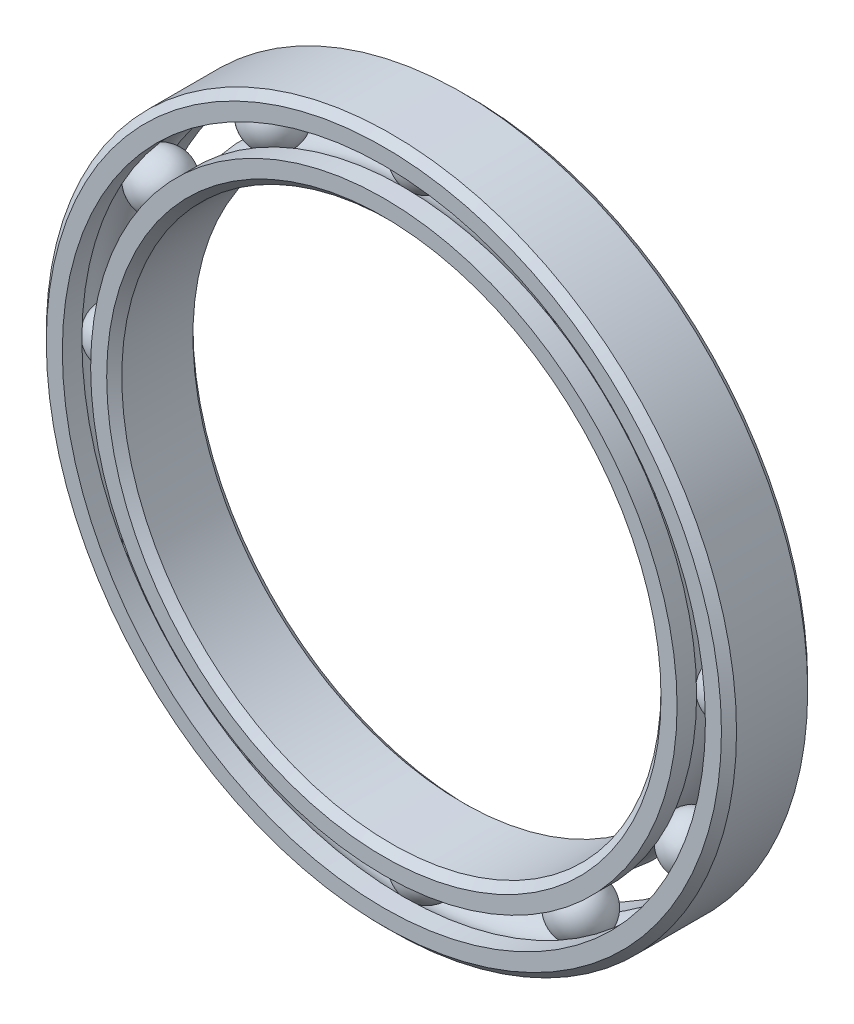
ISO-10303-21;
HEADER;
FILE_DESCRIPTION(('STEP AP214'),'2;1');
FILE_NAME('part.step','',(''),(''),'','','');
FILE_SCHEMA(('AUTOMOTIVE_DESIGN { 1 0 10303 214 1 1 1 1 }'));
ENDSEC;
DATA;
#1=APPLICATION_CONTEXT('core data for automotive mechanical design processes');
#2=APPLICATION_PROTOCOL_DEFINITION('international standard','automotive_design',2000,#1);
#3=PRODUCT_CONTEXT('',#1,'mechanical');
#4=PRODUCT('Part','Part','',(#3));
#5=PRODUCT_RELATED_PRODUCT_CATEGORY('part','',(#4));
#6=PRODUCT_DEFINITION_FORMATION('','',#4);
#7=PRODUCT_DEFINITION_CONTEXT('part definition',#1,'design');
#8=PRODUCT_DEFINITION('design','',#6,#7);
#9=PRODUCT_DEFINITION_SHAPE('','',#8);
#10=(LENGTH_UNIT() NAMED_UNIT(*) SI_UNIT(.MILLI.,.METRE.));
#11=(NAMED_UNIT(*) PLANE_ANGLE_UNIT() SI_UNIT($,.RADIAN.));
#12=(NAMED_UNIT(*) SI_UNIT($,.STERADIAN.) SOLID_ANGLE_UNIT());
#13=UNCERTAINTY_MEASURE_WITH_UNIT(LENGTH_MEASURE(1.E-05),#10,'distance_accuracy_value','');
#14=(GEOMETRIC_REPRESENTATION_CONTEXT(3) GLOBAL_UNCERTAINTY_ASSIGNED_CONTEXT((#13)) GLOBAL_UNIT_ASSIGNED_CONTEXT((#10,
#11,#12)) REPRESENTATION_CONTEXT('',''));
#15=CARTESIAN_POINT('',(0.,0.,0.));
#16=DIRECTION('',(0.,0.,1.));
#17=DIRECTION('',(1.,0.,0.));
#18=AXIS2_PLACEMENT_3D('',#15,#16,#17);
#19=CARTESIAN_POINT('',(-7.12499999999984,12.3408620039283,0.));
#20=DIRECTION('',(0.,0.,1.));
#21=DIRECTION('',(-0.499999999999989,0.866025403784445,0.));
#22=AXIS2_PLACEMENT_3D('',#19,#20,#21);
#23=SPHERICAL_SURFACE('',#22,1.27579703293945);
#24=CARTESIAN_POINT('',(-7.12499999999984,12.3408620039283,1.27579703293945));
#25=VERTEX_POINT('',#24);
#26=VERTEX_LOOP('',#25);
#27=FACE_BOUND('',#26,.T.);
#28=ADVANCED_FACE('F38',(#27),#23,.T.);
#29=CLOSED_SHELL('',(#28));
#30=MANIFOLD_SOLID_BREP('B2',#29);
#31=CARTESIAN_POINT('',(-12.3408620039282,7.12500000000014,0.));
#32=DIRECTION('',(0.,0.,1.));
#33=DIRECTION('',(-0.866025403784433,0.50000000000001,0.));
#34=AXIS2_PLACEMENT_3D('',#31,#32,#33);
#35=SPHERICAL_SURFACE('',#34,1.27579703293945);
#36=CARTESIAN_POINT('',(-12.3408620039282,7.12500000000014,1.27579703293945));
#37=VERTEX_POINT('',#36);
#38=VERTEX_LOOP('',#37);
#39=FACE_BOUND('',#38,.T.);
#40=ADVANCED_FACE('F59',(#39),#35,.T.);
#41=CLOSED_SHELL('',(#40));
#42=MANIFOLD_SOLID_BREP('B6',#41);
#43=CARTESIAN_POINT('',(-14.25,1.49260827235544E-13,0.));
#44=DIRECTION('',(0.,0.,1.));
#45=DIRECTION('',(-1.,0.,0.));
#46=AXIS2_PLACEMENT_3D('',#43,#44,#45);
#47=SPHERICAL_SURFACE('',#46,1.27579703293945);
#48=CARTESIAN_POINT('',(-14.25,1.49260827235544E-13,1.27579703293945));
#49=VERTEX_POINT('',#48);
#50=VERTEX_LOOP('',#49);
#51=FACE_BOUND('',#50,.T.);
#52=ADVANCED_FACE('F80',(#51),#47,.T.);
#53=CLOSED_SHELL('',(#52));
#54=MANIFOLD_SOLID_BREP('B34',#53);
#55=CARTESIAN_POINT('',(-12.3408620039283,-7.12499999999989,0.));
#56=DIRECTION('',(0.,0.,1.));
#57=DIRECTION('',(-0.866025403784443,-0.499999999999992,0.));
#58=AXIS2_PLACEMENT_3D('',#55,#56,#57);
#59=SPHERICAL_SURFACE('',#58,1.27579703293945);
#60=CARTESIAN_POINT('',(-12.3408620039283,-7.12499999999989,1.27579703293945));
#61=VERTEX_POINT('',#60);
#62=VERTEX_LOOP('',#61);
#63=FACE_BOUND('',#62,.T.);
#64=ADVANCED_FACE('F101',(#63),#59,.T.);
#65=CLOSED_SHELL('',(#64));
#66=MANIFOLD_SOLID_BREP('B55',#65);
#67=CARTESIAN_POINT('',(-7.1250000000001,-12.3408620039282,0.));
#68=DIRECTION('',(0.,0.,1.));
#69=DIRECTION('',(-0.500000000000007,-0.866025403784435,0.));
#70=AXIS2_PLACEMENT_3D('',#67,#68,#69);
#71=SPHERICAL_SURFACE('',#70,1.27579703293945);
#72=CARTESIAN_POINT('',(-7.1250000000001,-12.3408620039282,1.27579703293945));
#73=VERTEX_POINT('',#72);
#74=VERTEX_LOOP('',#73);
#75=FACE_BOUND('',#74,.T.);
#76=ADVANCED_FACE('F122',(#75),#71,.T.);
#77=CLOSED_SHELL('',(#76));
#78=MANIFOLD_SOLID_BREP('B76',#77);
#79=CARTESIAN_POINT('',(0.,-14.25,0.));
#80=DIRECTION('',(0.,0.,1.));
#81=DIRECTION('',(0.,-1.,0.));
#82=AXIS2_PLACEMENT_3D('',#79,#80,#81);
#83=SPHERICAL_SURFACE('',#82,1.27579703293945);
#84=CARTESIAN_POINT('',(0.,-14.25,1.27579703293945));
#85=VERTEX_POINT('',#84);
#86=VERTEX_LOOP('',#85);
#87=FACE_BOUND('',#86,.T.);
#88=ADVANCED_FACE('F143',(#87),#83,.T.);
#89=CLOSED_SHELL('',(#88));
#90=MANIFOLD_SOLID_BREP('B97',#89);
#91=CARTESIAN_POINT('',(7.12499999999993,-12.3408620039283,0.));
#92=DIRECTION('',(0.,0.,1.));
#93=DIRECTION('',(0.499999999999995,-0.866025403784442,0.));
#94=AXIS2_PLACEMENT_3D('',#91,#92,#93);
#95=SPHERICAL_SURFACE('',#94,1.27579703293945);
#96=CARTESIAN_POINT('',(7.12499999999993,-12.3408620039283,1.27579703293945));
#97=VERTEX_POINT('',#96);
#98=VERTEX_LOOP('',#97);
#99=FACE_BOUND('',#98,.T.);
#100=ADVANCED_FACE('F164',(#99),#95,.T.);
#101=CLOSED_SHELL('',(#100));
#102=MANIFOLD_SOLID_BREP('B118',#101);
#103=CARTESIAN_POINT('',(12.3408620039282,-7.12500000000006,0.));
#104=DIRECTION('',(0.,0.,1.));
#105=DIRECTION('',(0.866025403784436,-0.500000000000004,0.));
#106=AXIS2_PLACEMENT_3D('',#103,#104,#105);
#107=SPHERICAL_SURFACE('',#106,1.27579703293945);
#108=CARTESIAN_POINT('',(12.3408620039282,-7.12500000000006,1.27579703293945));
#109=VERTEX_POINT('',#108);
#110=VERTEX_LOOP('',#109);
#111=FACE_BOUND('',#110,.T.);
#112=ADVANCED_FACE('F185',(#111),#107,.T.);
#113=CLOSED_SHELL('',(#112));
#114=MANIFOLD_SOLID_BREP('B139',#113);
#115=CARTESIAN_POINT('',(14.25,0.,0.));
#116=DIRECTION('',(0.,0.,1.));
#117=DIRECTION('',(1.,0.,0.));
#118=AXIS2_PLACEMENT_3D('',#115,#116,#117);
#119=SPHERICAL_SURFACE('',#118,1.27579703293945);
#120=CARTESIAN_POINT('',(14.25,0.,1.27579703293945));
#121=VERTEX_POINT('',#120);
#122=VERTEX_LOOP('',#121);
#123=FACE_BOUND('',#122,.T.);
#124=ADVANCED_FACE('F206',(#123),#119,.T.);
#125=CLOSED_SHELL('',(#124));
#126=MANIFOLD_SOLID_BREP('B160',#125);
#127=CARTESIAN_POINT('',(12.3408620039283,7.12499999999997,0.));
#128=DIRECTION('',(0.,0.,1.));
#129=DIRECTION('',(0.86602540378444,0.499999999999998,0.));
#130=AXIS2_PLACEMENT_3D('',#127,#128,#129);
#131=SPHERICAL_SURFACE('',#130,1.27579703293945);
#132=CARTESIAN_POINT('',(12.3408620039283,7.12499999999997,1.27579703293945));
#133=VERTEX_POINT('',#132);
#134=VERTEX_LOOP('',#133);
#135=FACE_BOUND('',#134,.T.);
#136=ADVANCED_FACE('F227',(#135),#131,.T.);
#137=CLOSED_SHELL('',(#136));
#138=MANIFOLD_SOLID_BREP('B181',#137);
#139=CARTESIAN_POINT('',(7.12500000000001,12.3408620039282,0.));
#140=DIRECTION('',(0.,0.,1.));
#141=DIRECTION('',(0.500000000000001,0.866025403784438,0.));
#142=AXIS2_PLACEMENT_3D('',#139,#140,#141);
#143=SPHERICAL_SURFACE('',#142,1.27579703293945);
#144=CARTESIAN_POINT('',(7.12500000000001,12.3408620039282,1.27579703293945));
#145=VERTEX_POINT('',#144);
#146=VERTEX_LOOP('',#145);
#147=FACE_BOUND('',#146,.T.);
#148=ADVANCED_FACE('F248',(#147),#143,.T.);
#149=CLOSED_SHELL('',(#148));
#150=MANIFOLD_SOLID_BREP('B202',#149);
#151=CARTESIAN_POINT('',(0.,14.25,0.));
#152=DIRECTION('',(0.,0.,1.));
#153=DIRECTION('',(0.,1.,0.));
#154=AXIS2_PLACEMENT_3D('',#151,#152,#153);
#155=SPHERICAL_SURFACE('',#154,1.27579703293945);
#156=CARTESIAN_POINT('',(0.,14.25,1.27579703293945));
#157=VERTEX_POINT('',#156);
#158=VERTEX_LOOP('',#157);
#159=FACE_BOUND('',#158,.T.);
#160=ADVANCED_FACE('F271',(#159),#155,.T.);
#161=CLOSED_SHELL('',(#160));
#162=MANIFOLD_SOLID_BREP('B223',#161);
#163=CARTESIAN_POINT('',(0.,13.5936973450183,2.));
#164=DIRECTION('',(0.,0.,-1.));
#165=DIRECTION('',(-1.,0.,0.));
#166=AXIS2_PLACEMENT_3D('',#163,#164,#165);
#167=PLANE('',#166);
#168=CARTESIAN_POINT('',(0.,0.,2.));
#169=DIRECTION('',(0.,0.,1.));
#170=DIRECTION('',(1.,0.,0.));
#171=AXIS2_PLACEMENT_3D('',#168,#169,#170);
#172=CIRCLE('',#171,12.85);
#173=CARTESIAN_POINT('',(12.85,0.,2.));
#174=VERTEX_POINT('',#173);
#175=EDGE_CURVE('E319',#174,#174,#172,.T.);
#176=ORIENTED_EDGE('',*,*,#175,.F.);
#177=EDGE_LOOP('',(#176));
#178=FACE_BOUND('',#177,.T.);
#179=CARTESIAN_POINT('',(0.,0.,2.));
#180=DIRECTION('',(0.,0.,1.));
#181=DIRECTION('',(1.,0.,0.));
#182=AXIS2_PLACEMENT_3D('',#179,#180,#181);
#183=CIRCLE('',#182,13.5936973450183);
#184=CARTESIAN_POINT('',(13.5936973450183,0.,2.));
#185=VERTEX_POINT('',#184);
#186=EDGE_CURVE('E270',#185,#185,#183,.T.);
#187=ORIENTED_EDGE('',*,*,#186,.T.);
#188=EDGE_LOOP('',(#187));
#189=FACE_BOUND('',#188,.T.);
#190=ADVANCED_FACE('F291',(#178,#189),#167,.F.);
#191=CARTESIAN_POINT('',(0.,0.,2.));
#192=DIRECTION('',(0.,0.,1.));
#193=DIRECTION('',(1.,0.,0.));
#194=AXIS2_PLACEMENT_3D('',#191,#192,#193);
#195=CYLINDRICAL_SURFACE('',#194,13.5936973450183);
#196=ORIENTED_EDGE('',*,*,#186,.F.);
#197=EDGE_LOOP('',(#196));
#198=FACE_BOUND('',#197,.T.);
#199=CARTESIAN_POINT('',(0.,0.,1.0940406273631));
#200=DIRECTION('',(0.,0.,1.));
#201=DIRECTION('',(1.,0.,0.));
#202=AXIS2_PLACEMENT_3D('',#199,#200,#201);
#203=CIRCLE('',#202,13.5936973450183);
#204=CARTESIAN_POINT('',(13.5936973450183,0.,1.0940406273631));
#205=VERTEX_POINT('',#204);
#206=EDGE_CURVE('E297',#205,#205,#203,.T.);
#207=ORIENTED_EDGE('',*,*,#206,.T.);
#208=EDGE_LOOP('',(#207));
#209=FACE_BOUND('',#208,.T.);
#210=ADVANCED_FACE('F326',(#198,#209),#195,.T.);
#211=CARTESIAN_POINT('',(0.,0.,0.));
#212=DIRECTION('',(0.,0.,1.));
#213=DIRECTION('',(1.,0.,0.));
#214=AXIS2_PLACEMENT_3D('',#211,#212,#213);
#215=TOROIDAL_SURFACE('',#214,14.25,1.27579703293944);
#216=ORIENTED_EDGE('',*,*,#206,.F.);
#217=EDGE_LOOP('',(#216));
#218=FACE_BOUND('',#217,.T.);
#219=CARTESIAN_POINT('',(0.,0.,-1.0940406273631));
#220=DIRECTION('',(0.,0.,1.));
#221=DIRECTION('',(1.,0.,0.));
#222=AXIS2_PLACEMENT_3D('',#219,#220,#221);
#223=CIRCLE('',#222,13.5936973450183);
#224=CARTESIAN_POINT('',(13.5936973450183,0.,-1.0940406273631));
#225=VERTEX_POINT('',#224);
#226=EDGE_CURVE('E301',#225,#225,#223,.T.);
#227=ORIENTED_EDGE('',*,*,#226,.T.);
#228=EDGE_LOOP('',(#227));
#229=FACE_BOUND('',#228,.T.);
#230=ADVANCED_FACE('F330',(#218,#229),#215,.F.);
#231=CARTESIAN_POINT('',(0.,0.,2.));
#232=DIRECTION('',(0.,0.,1.));
#233=DIRECTION('',(1.,0.,0.));
#234=AXIS2_PLACEMENT_3D('',#231,#232,#233);
#235=CYLINDRICAL_SURFACE('',#234,13.5936973450183);
#236=ORIENTED_EDGE('',*,*,#226,.F.);
#237=EDGE_LOOP('',(#236));
#238=FACE_BOUND('',#237,.T.);
#239=CARTESIAN_POINT('',(0.,0.,-2.));
#240=DIRECTION('',(0.,0.,1.));
#241=DIRECTION('',(1.,0.,0.));
#242=AXIS2_PLACEMENT_3D('',#239,#240,#241);
#243=CIRCLE('',#242,13.5936973450183);
#244=CARTESIAN_POINT('',(13.5936973450183,0.,-2.));
#245=VERTEX_POINT('',#244);
#246=EDGE_CURVE('E305',#245,#245,#243,.T.);
#247=ORIENTED_EDGE('',*,*,#246,.T.);
#248=EDGE_LOOP('',(#247));
#249=FACE_BOUND('',#248,.T.);
#250=ADVANCED_FACE('F335',(#238,#249),#235,.T.);
#251=CARTESIAN_POINT('',(0.,12.85,-2.));
#252=DIRECTION('',(0.,0.,1.));
#253=DIRECTION('',(1.,0.,0.));
#254=AXIS2_PLACEMENT_3D('',#251,#252,#253);
#255=PLANE('',#254);
#256=ORIENTED_EDGE('',*,*,#246,.F.);
#257=EDGE_LOOP('',(#256));
#258=FACE_BOUND('',#257,.T.);
#259=CARTESIAN_POINT('',(0.,0.,-2.));
#260=DIRECTION('',(0.,0.,1.));
#261=DIRECTION('',(1.,0.,0.));
#262=AXIS2_PLACEMENT_3D('',#259,#260,#261);
#263=CIRCLE('',#262,12.85);
#264=CARTESIAN_POINT('',(12.85,0.,-2.));
#265=VERTEX_POINT('',#264);
#266=EDGE_CURVE('E310',#265,#265,#263,.T.);
#267=ORIENTED_EDGE('',*,*,#266,.T.);
#268=EDGE_LOOP('',(#267));
#269=FACE_BOUND('',#268,.T.);
#270=ADVANCED_FACE('F341',(#258,#269),#255,.F.);
#271=CARTESIAN_POINT('',(0.,0.,-1.65));
#272=DIRECTION('',(0.,0.,-1.));
#273=DIRECTION('',(-1.,0.,0.));
#274=AXIS2_PLACEMENT_3D('',#271,#272,#273);
#275=CONICAL_SURFACE('',#274,12.5,0.785398163397443);
#276=ORIENTED_EDGE('',*,*,#266,.F.);
#277=EDGE_LOOP('',(#276));
#278=FACE_BOUND('',#277,.T.);
#279=CARTESIAN_POINT('',(0.,0.,-1.65));
#280=DIRECTION('',(0.,0.,1.));
#281=DIRECTION('',(1.,0.,0.));
#282=AXIS2_PLACEMENT_3D('',#279,#280,#281);
#283=CIRCLE('',#282,12.5);
#284=CARTESIAN_POINT('',(12.5,0.,-1.65));
#285=VERTEX_POINT('',#284);
#286=EDGE_CURVE('E313',#285,#285,#283,.T.);
#287=ORIENTED_EDGE('',*,*,#286,.T.);
#288=EDGE_LOOP('',(#287));
#289=FACE_BOUND('',#288,.T.);
#290=ADVANCED_FACE('F345',(#278,#289),#275,.F.);
#291=CARTESIAN_POINT('',(0.,0.,2.));
#292=DIRECTION('',(0.,0.,1.));
#293=DIRECTION('',(1.,0.,0.));
#294=AXIS2_PLACEMENT_3D('',#291,#292,#293);
#295=CYLINDRICAL_SURFACE('',#294,12.5);
#296=ORIENTED_EDGE('',*,*,#286,.F.);
#297=EDGE_LOOP('',(#296));
#298=FACE_BOUND('',#297,.T.);
#299=CARTESIAN_POINT('',(0.,0.,1.65000000000001));
#300=DIRECTION('',(0.,0.,1.));
#301=DIRECTION('',(1.,0.,0.));
#302=AXIS2_PLACEMENT_3D('',#299,#300,#301);
#303=CIRCLE('',#302,12.5);
#304=CARTESIAN_POINT('',(12.5,0.,1.65000000000001));
#305=VERTEX_POINT('',#304);
#306=EDGE_CURVE('E316',#305,#305,#303,.T.);
#307=ORIENTED_EDGE('',*,*,#306,.T.);
#308=EDGE_LOOP('',(#307));
#309=FACE_BOUND('',#308,.T.);
#310=ADVANCED_FACE('F349',(#298,#309),#295,.F.);
#311=CARTESIAN_POINT('',(0.,0.,2.));
#312=DIRECTION('',(0.,0.,1.));
#313=DIRECTION('',(1.,0.,0.));
#314=AXIS2_PLACEMENT_3D('',#311,#312,#313);
#315=CONICAL_SURFACE('',#314,12.85,0.785398163397454);
#316=ORIENTED_EDGE('',*,*,#306,.F.);
#317=EDGE_LOOP('',(#316));
#318=FACE_BOUND('',#317,.T.);
#319=ORIENTED_EDGE('',*,*,#175,.T.);
#320=EDGE_LOOP('',(#319));
#321=FACE_BOUND('',#320,.T.);
#322=ADVANCED_FACE('F323',(#318,#321),#315,.F.);
#323=CLOSED_SHELL('',(#190,#210,#230,#250,#270,#290,#310,#322));
#324=MANIFOLD_SOLID_BREP('B244',#323);
#325=CARTESIAN_POINT('',(0.,0.,1.65));
#326=DIRECTION('',(0.,0.,-1.));
#327=DIRECTION('',(-1.,0.,0.));
#328=AXIS2_PLACEMENT_3D('',#325,#326,#327);
#329=CONICAL_SURFACE('',#328,16.,0.785398163397443);
#330=CARTESIAN_POINT('',(0.,0.,2.));
#331=DIRECTION('',(0.,0.,1.));
#332=DIRECTION('',(1.,0.,0.));
#333=AXIS2_PLACEMENT_3D('',#330,#331,#332);
#334=CIRCLE('',#333,15.65);
#335=CARTESIAN_POINT('',(15.65,0.,2.));
#336=VERTEX_POINT('',#335);
#337=EDGE_CURVE('E441',#336,#336,#334,.T.);
#338=ORIENTED_EDGE('',*,*,#337,.F.);
#339=EDGE_LOOP('',(#338));
#340=FACE_BOUND('',#339,.T.);
#341=CARTESIAN_POINT('',(0.,0.,1.65));
#342=DIRECTION('',(0.,0.,1.));
#343=DIRECTION('',(1.,0.,0.));
#344=AXIS2_PLACEMENT_3D('',#341,#342,#343);
#345=CIRCLE('',#344,16.);
#346=CARTESIAN_POINT('',(16.,0.,1.65));
#347=VERTEX_POINT('',#346);
#348=EDGE_CURVE('E290',#347,#347,#345,.T.);
#349=ORIENTED_EDGE('',*,*,#348,.T.);
#350=EDGE_LOOP('',(#349));
#351=FACE_BOUND('',#350,.T.);
#352=ADVANCED_FACE('F413',(#340,#351),#329,.T.);
#353=CARTESIAN_POINT('',(0.,0.,2.));
#354=DIRECTION('',(0.,0.,1.));
#355=DIRECTION('',(1.,0.,0.));
#356=AXIS2_PLACEMENT_3D('',#353,#354,#355);
#357=CYLINDRICAL_SURFACE('',#356,16.);
#358=ORIENTED_EDGE('',*,*,#348,.F.);
#359=EDGE_LOOP('',(#358));
#360=FACE_BOUND('',#359,.T.);
#361=CARTESIAN_POINT('',(0.,0.,-1.65));
#362=DIRECTION('',(0.,0.,1.));
#363=DIRECTION('',(1.,0.,0.));
#364=AXIS2_PLACEMENT_3D('',#361,#362,#363);
#365=CIRCLE('',#364,16.);
#366=CARTESIAN_POINT('',(16.,0.,-1.65));
#367=VERTEX_POINT('',#366);
#368=EDGE_CURVE('E419',#367,#367,#365,.T.);
#369=ORIENTED_EDGE('',*,*,#368,.T.);
#370=EDGE_LOOP('',(#369));
#371=FACE_BOUND('',#370,.T.);
#372=ADVANCED_FACE('F448',(#360,#371),#357,.T.);
#373=CARTESIAN_POINT('',(0.,0.,-2.));
#374=DIRECTION('',(0.,0.,1.));
#375=DIRECTION('',(1.,0.,0.));
#376=AXIS2_PLACEMENT_3D('',#373,#374,#375);
#377=CONICAL_SURFACE('',#376,15.65,0.785398163397443);
#378=ORIENTED_EDGE('',*,*,#368,.F.);
#379=EDGE_LOOP('',(#378));
#380=FACE_BOUND('',#379,.T.);
#381=CARTESIAN_POINT('',(0.,0.,-2.));
#382=DIRECTION('',(0.,0.,1.));
#383=DIRECTION('',(1.,0.,0.));
#384=AXIS2_PLACEMENT_3D('',#381,#382,#383);
#385=CIRCLE('',#384,15.65);
#386=CARTESIAN_POINT('',(15.65,0.,-2.));
#387=VERTEX_POINT('',#386);
#388=EDGE_CURVE('E423',#387,#387,#385,.T.);
#389=ORIENTED_EDGE('',*,*,#388,.T.);
#390=EDGE_LOOP('',(#389));
#391=FACE_BOUND('',#390,.T.);
#392=ADVANCED_FACE('F452',(#380,#391),#377,.T.);
#393=CARTESIAN_POINT('',(0.,15.65,-2.00000000000001));
#394=DIRECTION('',(0.,0.,1.));
#395=DIRECTION('',(1.,0.,0.));
#396=AXIS2_PLACEMENT_3D('',#393,#394,#395);
#397=PLANE('',#396);
#398=ORIENTED_EDGE('',*,*,#388,.F.);
#399=EDGE_LOOP('',(#398));
#400=FACE_BOUND('',#399,.T.);
#401=CARTESIAN_POINT('',(0.,0.,-2.00000000000001));
#402=DIRECTION('',(0.,0.,1.));
#403=DIRECTION('',(1.,0.,0.));
#404=AXIS2_PLACEMENT_3D('',#401,#402,#403);
#405=CIRCLE('',#404,14.9063026549817);
#406=CARTESIAN_POINT('',(14.9063026549817,0.,-2.00000000000001));
#407=VERTEX_POINT('',#406);
#408=EDGE_CURVE('E427',#407,#407,#405,.T.);
#409=ORIENTED_EDGE('',*,*,#408,.T.);
#410=EDGE_LOOP('',(#409));
#411=FACE_BOUND('',#410,.T.);
#412=ADVANCED_FACE('F457',(#400,#411),#397,.F.);
#413=CARTESIAN_POINT('',(0.,0.,2.));
#414=DIRECTION('',(0.,0.,1.));
#415=DIRECTION('',(1.,0.,0.));
#416=AXIS2_PLACEMENT_3D('',#413,#414,#415);
#417=CYLINDRICAL_SURFACE('',#416,14.9063026549817);
#418=ORIENTED_EDGE('',*,*,#408,.F.);
#419=EDGE_LOOP('',(#418));
#420=FACE_BOUND('',#419,.T.);
#421=CARTESIAN_POINT('',(0.,0.,-1.09404062736311));
#422=DIRECTION('',(0.,0.,1.));
#423=DIRECTION('',(1.,0.,0.));
#424=AXIS2_PLACEMENT_3D('',#421,#422,#423);
#425=CIRCLE('',#424,14.9063026549817);
#426=CARTESIAN_POINT('',(14.9063026549817,0.,-1.09404062736311));
#427=VERTEX_POINT('',#426);
#428=EDGE_CURVE('E432',#427,#427,#425,.T.);
#429=ORIENTED_EDGE('',*,*,#428,.T.);
#430=EDGE_LOOP('',(#429));
#431=FACE_BOUND('',#430,.T.);
#432=ADVANCED_FACE('F463',(#420,#431),#417,.F.);
#433=CARTESIAN_POINT('',(0.,0.,0.));
#434=DIRECTION('',(0.,0.,1.));
#435=DIRECTION('',(1.,0.,0.));
#436=AXIS2_PLACEMENT_3D('',#433,#434,#435);
#437=TOROIDAL_SURFACE('',#436,14.25,1.27579703293945);
#438=ORIENTED_EDGE('',*,*,#428,.F.);
#439=EDGE_LOOP('',(#438));
#440=FACE_BOUND('',#439,.T.);
#441=CARTESIAN_POINT('',(0.,0.,1.0940406273631));
#442=DIRECTION('',(0.,0.,1.));
#443=DIRECTION('',(1.,0.,0.));
#444=AXIS2_PLACEMENT_3D('',#441,#442,#443);
#445=CIRCLE('',#444,14.9063026549817);
#446=CARTESIAN_POINT('',(14.9063026549817,0.,1.0940406273631));
#447=VERTEX_POINT('',#446);
#448=EDGE_CURVE('E435',#447,#447,#445,.T.);
#449=ORIENTED_EDGE('',*,*,#448,.T.);
#450=EDGE_LOOP('',(#449));
#451=FACE_BOUND('',#450,.T.);
#452=ADVANCED_FACE('F467',(#440,#451),#437,.F.);
#453=CARTESIAN_POINT('',(0.,0.,2.));
#454=DIRECTION('',(0.,0.,1.));
#455=DIRECTION('',(1.,0.,0.));
#456=AXIS2_PLACEMENT_3D('',#453,#454,#455);
#457=CYLINDRICAL_SURFACE('',#456,14.9063026549817);
#458=ORIENTED_EDGE('',*,*,#448,.F.);
#459=EDGE_LOOP('',(#458));
#460=FACE_BOUND('',#459,.T.);
#461=CARTESIAN_POINT('',(0.,0.,2.));
#462=DIRECTION('',(0.,0.,1.));
#463=DIRECTION('',(1.,0.,0.));
#464=AXIS2_PLACEMENT_3D('',#461,#462,#463);
#465=CIRCLE('',#464,14.9063026549817);
#466=CARTESIAN_POINT('',(14.9063026549817,0.,2.));
#467=VERTEX_POINT('',#466);
#468=EDGE_CURVE('E438',#467,#467,#465,.T.);
#469=ORIENTED_EDGE('',*,*,#468,.T.);
#470=EDGE_LOOP('',(#469));
#471=FACE_BOUND('',#470,.T.);
#472=ADVANCED_FACE('F471',(#460,#471),#457,.F.);
#473=CARTESIAN_POINT('',(0.,15.65,2.));
#474=DIRECTION('',(0.,0.,-1.));
#475=DIRECTION('',(-1.,0.,0.));
#476=AXIS2_PLACEMENT_3D('',#473,#474,#475);
#477=PLANE('',#476);
#478=ORIENTED_EDGE('',*,*,#468,.F.);
#479=EDGE_LOOP('',(#478));
#480=FACE_BOUND('',#479,.T.);
#481=ORIENTED_EDGE('',*,*,#337,.T.);
#482=EDGE_LOOP('',(#481));
#483=FACE_BOUND('',#482,.T.);
#484=ADVANCED_FACE('F445',(#480,#483),#477,.F.);
#485=CLOSED_SHELL('',(#352,#372,#392,#412,#432,#452,#472,#484));
#486=MANIFOLD_SOLID_BREP('B265',#485);
#487=ADVANCED_BREP_SHAPE_REPRESENTATION('',(#18,#30,#42,#54,#66,#78,#90,#102,#114,#126,#138,
#150,#162,#324,#486),#14);
#488=SHAPE_DEFINITION_REPRESENTATION(#9,#487);
ENDSEC;
END-ISO-10303-21;
